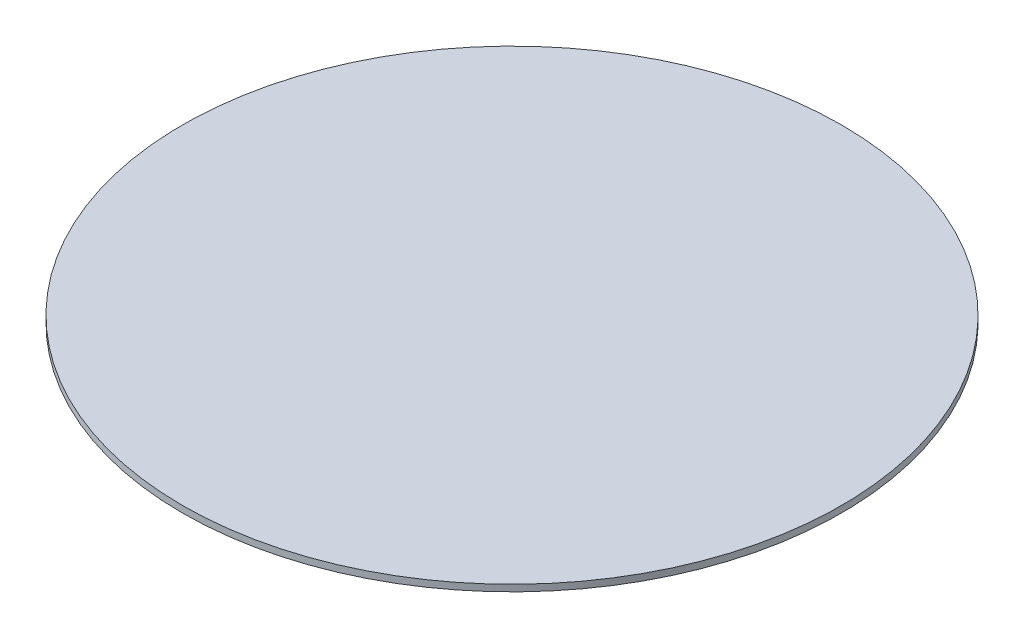
ISO-10303-21;
HEADER;
FILE_DESCRIPTION(('STEP AP214'),'2;1');
FILE_NAME('part.step','',(''),(''),'','','');
FILE_SCHEMA(('AUTOMOTIVE_DESIGN { 1 0 10303 214 1 1 1 1 }'));
ENDSEC;
DATA;
#1=APPLICATION_CONTEXT('core data for automotive mechanical design processes');
#2=APPLICATION_PROTOCOL_DEFINITION('international standard','automotive_design',2000,#1);
#3=PRODUCT_CONTEXT('',#1,'mechanical');
#4=PRODUCT('Part','Part','',(#3));
#5=PRODUCT_RELATED_PRODUCT_CATEGORY('part','',(#4));
#6=PRODUCT_DEFINITION_FORMATION('','',#4);
#7=PRODUCT_DEFINITION_CONTEXT('part definition',#1,'design');
#8=PRODUCT_DEFINITION('design','',#6,#7);
#9=PRODUCT_DEFINITION_SHAPE('','',#8);
#10=(LENGTH_UNIT() NAMED_UNIT(*) SI_UNIT(.MILLI.,.METRE.));
#11=(NAMED_UNIT(*) PLANE_ANGLE_UNIT() SI_UNIT($,.RADIAN.));
#12=(NAMED_UNIT(*) SI_UNIT($,.STERADIAN.) SOLID_ANGLE_UNIT());
#13=UNCERTAINTY_MEASURE_WITH_UNIT(LENGTH_MEASURE(1.E-05),#10,'distance_accuracy_value','');
#14=(GEOMETRIC_REPRESENTATION_CONTEXT(3) GLOBAL_UNCERTAINTY_ASSIGNED_CONTEXT((#13)) GLOBAL_UNIT_ASSIGNED_CONTEXT((#10,
#11,#12)) REPRESENTATION_CONTEXT('',''));
#15=CARTESIAN_POINT('',(0.,0.,0.));
#16=DIRECTION('',(0.,0.,1.));
#17=DIRECTION('',(1.,0.,0.));
#18=AXIS2_PLACEMENT_3D('',#15,#16,#17);
#19=CARTESIAN_POINT('',(0.,10.,0.));
#20=DIRECTION('',(0.,-1.,0.));
#21=DIRECTION('',(0.,0.,-1.));
#22=AXIS2_PLACEMENT_3D('',#19,#20,#21);
#23=CYLINDRICAL_SURFACE('',#22,500.);
#24=CARTESIAN_POINT('',(0.,10.,0.));
#25=DIRECTION('',(0.,1.,0.));
#26=DIRECTION('',(0.,0.,1.));
#27=AXIS2_PLACEMENT_3D('',#24,#25,#26);
#28=CIRCLE('',#27,500.);
#29=CARTESIAN_POINT('',(0.,10.,500.));
#30=VERTEX_POINT('',#29);
#31=EDGE_CURVE('E10',#30,#30,#28,.T.);
#32=ORIENTED_EDGE('',*,*,#31,.F.);
#33=EDGE_LOOP('',(#32));
#34=FACE_BOUND('',#33,.T.);
#35=CARTESIAN_POINT('',(0.,0.,0.));
#36=DIRECTION('',(0.,1.,0.));
#37=DIRECTION('',(0.,0.,1.));
#38=AXIS2_PLACEMENT_3D('',#35,#36,#37);
#39=CIRCLE('',#38,500.);
#40=CARTESIAN_POINT('',(0.,0.,500.));
#41=VERTEX_POINT('',#40);
#42=EDGE_CURVE('E40',#41,#41,#39,.T.);
#43=ORIENTED_EDGE('',*,*,#42,.T.);
#44=EDGE_LOOP('',(#43));
#45=FACE_BOUND('',#44,.T.);
#46=ADVANCED_FACE('F37',(#34,#45),#23,.T.);
#47=CARTESIAN_POINT('',(0.,10.,0.));
#48=DIRECTION('',(0.,1.,0.));
#49=DIRECTION('',(0.,0.,1.));
#50=AXIS2_PLACEMENT_3D('',#47,#48,#49);
#51=PLANE('',#50);
#52=ORIENTED_EDGE('',*,*,#31,.T.);
#53=EDGE_LOOP('',(#52));
#54=FACE_BOUND('',#53,.T.);
#55=ADVANCED_FACE('F54',(#54),#51,.T.);
#56=CARTESIAN_POINT('',(0.,0.,0.));
#57=DIRECTION('',(0.,1.,0.));
#58=DIRECTION('',(0.,0.,1.));
#59=AXIS2_PLACEMENT_3D('',#56,#57,#58);
#60=PLANE('',#59);
#61=ORIENTED_EDGE('',*,*,#42,.F.);
#62=EDGE_LOOP('',(#61));
#63=FACE_BOUND('',#62,.T.);
#64=ADVANCED_FACE('F52',(#63),#60,.F.);
#65=CLOSED_SHELL('',(#46,#55,#64));
#66=MANIFOLD_SOLID_BREP('B2',#65);
#67=ADVANCED_BREP_SHAPE_REPRESENTATION('',(#18,#66),#14);
#68=SHAPE_DEFINITION_REPRESENTATION(#9,#67);
ENDSEC;
END-ISO-10303-21;
